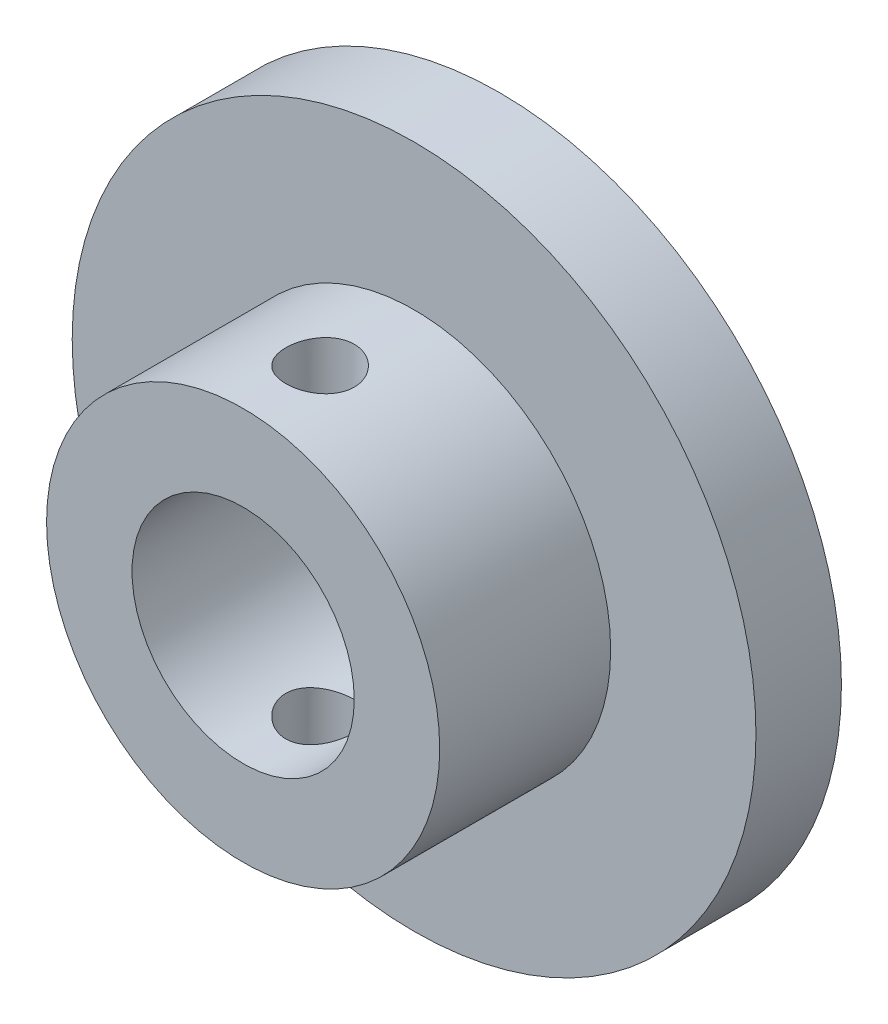
ISO-10303-21;
HEADER;
FILE_DESCRIPTION(('STEP AP214'),'2;1');
FILE_NAME('part.step','',(''),(''),'','','');
FILE_SCHEMA(('AUTOMOTIVE_DESIGN { 1 0 10303 214 1 1 1 1 }'));
ENDSEC;
DATA;
#1=APPLICATION_CONTEXT('core data for automotive mechanical design processes');
#2=APPLICATION_PROTOCOL_DEFINITION('international standard','automotive_design',2000,#1);
#3=PRODUCT_CONTEXT('',#1,'mechanical');
#4=PRODUCT('Part','Part','',(#3));
#5=PRODUCT_RELATED_PRODUCT_CATEGORY('part','',(#4));
#6=PRODUCT_DEFINITION_FORMATION('','',#4);
#7=PRODUCT_DEFINITION_CONTEXT('part definition',#1,'design');
#8=PRODUCT_DEFINITION('design','',#6,#7);
#9=PRODUCT_DEFINITION_SHAPE('','',#8);
#10=(LENGTH_UNIT() NAMED_UNIT(*) SI_UNIT(.MILLI.,.METRE.));
#11=(NAMED_UNIT(*) PLANE_ANGLE_UNIT() SI_UNIT($,.RADIAN.));
#12=(NAMED_UNIT(*) SI_UNIT($,.STERADIAN.) SOLID_ANGLE_UNIT());
#13=UNCERTAINTY_MEASURE_WITH_UNIT(LENGTH_MEASURE(1.E-05),#10,'distance_accuracy_value','');
#14=(GEOMETRIC_REPRESENTATION_CONTEXT(3) GLOBAL_UNCERTAINTY_ASSIGNED_CONTEXT((#13)) GLOBAL_UNIT_ASSIGNED_CONTEXT((#10,
#11,#12)) REPRESENTATION_CONTEXT('',''));
#15=CARTESIAN_POINT('',(0.,0.,0.));
#16=DIRECTION('',(0.,0.,1.));
#17=DIRECTION('',(1.,0.,0.));
#18=AXIS2_PLACEMENT_3D('',#15,#16,#17);
#19=CARTESIAN_POINT('',(0.,0.,2.5));
#20=DIRECTION('',(0.,0.,1.));
#21=DIRECTION('',(1.,0.,0.));
#22=AXIS2_PLACEMENT_3D('',#19,#20,#21);
#23=PLANE('',#22);
#24=CARTESIAN_POINT('',(0.,0.,2.5));
#25=DIRECTION('',(0.,0.,1.));
#26=DIRECTION('',(1.,0.,0.));
#27=AXIS2_PLACEMENT_3D('',#24,#25,#26);
#28=CIRCLE('',#27,20.);
#29=CARTESIAN_POINT('',(20.,0.,2.5));
#30=VERTEX_POINT('',#29);
#31=EDGE_CURVE('E10',#30,#30,#28,.T.);
#32=ORIENTED_EDGE('',*,*,#31,.T.);
#33=EDGE_LOOP('',(#32));
#34=FACE_BOUND('',#33,.T.);
#35=CARTESIAN_POINT('',(0.,0.,2.5));
#36=DIRECTION('',(0.,0.,1.));
#37=DIRECTION('',(1.,0.,0.));
#38=AXIS2_PLACEMENT_3D('',#35,#36,#37);
#39=CIRCLE('',#38,11.5);
#40=CARTESIAN_POINT('',(11.5,0.,2.5));
#41=VERTEX_POINT('',#40);
#42=EDGE_CURVE('E116',#41,#41,#39,.T.);
#43=ORIENTED_EDGE('',*,*,#42,.F.);
#44=EDGE_LOOP('',(#43));
#45=FACE_BOUND('',#44,.T.);
#46=ADVANCED_FACE('F37',(#34,#45),#23,.T.);
#47=CARTESIAN_POINT('',(0.,0.,-2.5));
#48=DIRECTION('',(0.,0.,1.));
#49=DIRECTION('',(1.,0.,0.));
#50=AXIS2_PLACEMENT_3D('',#47,#48,#49);
#51=PLANE('',#50);
#52=CARTESIAN_POINT('',(0.,0.,-2.5));
#53=DIRECTION('',(0.,0.,1.));
#54=DIRECTION('',(1.,0.,0.));
#55=AXIS2_PLACEMENT_3D('',#52,#53,#54);
#56=CIRCLE('',#55,20.);
#57=CARTESIAN_POINT('',(20.,0.,-2.5));
#58=VERTEX_POINT('',#57);
#59=EDGE_CURVE('E51',#58,#58,#56,.T.);
#60=ORIENTED_EDGE('',*,*,#59,.F.);
#61=EDGE_LOOP('',(#60));
#62=FACE_BOUND('',#61,.T.);
#63=CARTESIAN_POINT('',(0.,0.,-2.5));
#64=DIRECTION('',(0.,0.,1.));
#65=DIRECTION('',(1.,0.,0.));
#66=AXIS2_PLACEMENT_3D('',#63,#64,#65);
#67=CIRCLE('',#66,6.5);
#68=CARTESIAN_POINT('',(6.5,0.,-2.5));
#69=VERTEX_POINT('',#68);
#70=EDGE_CURVE('E57',#69,#69,#67,.T.);
#71=ORIENTED_EDGE('',*,*,#70,.T.);
#72=EDGE_LOOP('',(#71));
#73=FACE_BOUND('',#72,.T.);
#74=ADVANCED_FACE('F100',(#62,#73),#51,.F.);
#75=CARTESIAN_POINT('',(0.,0.,2.5));
#76=DIRECTION('',(0.,0.,-1.));
#77=DIRECTION('',(-1.,0.,0.));
#78=AXIS2_PLACEMENT_3D('',#75,#76,#77);
#79=CYLINDRICAL_SURFACE('',#78,20.);
#80=ORIENTED_EDGE('',*,*,#31,.F.);
#81=EDGE_LOOP('',(#80));
#82=FACE_BOUND('',#81,.T.);
#83=ORIENTED_EDGE('',*,*,#59,.T.);
#84=EDGE_LOOP('',(#83));
#85=FACE_BOUND('',#84,.T.);
#86=ADVANCED_FACE('F39',(#82,#85),#79,.T.);
#87=CARTESIAN_POINT('',(0.,0.,2.5));
#88=DIRECTION('',(0.,0.,-1.));
#89=DIRECTION('',(-1.,0.,0.));
#90=AXIS2_PLACEMENT_3D('',#87,#88,#89);
#91=CYLINDRICAL_SURFACE('',#90,6.5);
#92=CARTESIAN_POINT('',(0.,-6.5,10.));
#93=CARTESIAN_POINT('',(0.109586471554081,-6.49999929187436,9.99999903907904));
#94=CARTESIAN_POINT('',(0.219182761349476,-6.49720235792931,9.99096335239673));
#95=CARTESIAN_POINT('',(0.435175528984374,-6.48631855265072,9.95515058806477));
#96=CARTESIAN_POINT('',(0.541571186300282,-6.47823033671536,9.92836900086749));
#97=CARTESIAN_POINT('',(0.748016546984702,-6.45764858487676,9.85804929310721));
#98=CARTESIAN_POINT('',(0.848075627090344,-6.44516174661238,9.81453663922322));
#99=CARTESIAN_POINT('',(1.03947745536718,-6.41707535917941,9.71209679263277));
#100=CARTESIAN_POINT('',(1.13081890919355,-6.40147534884382,9.65316731576617));
#101=CARTESIAN_POINT('',(1.30493699247679,-6.36829752406617,9.51970232456006));
#102=CARTESIAN_POINT('',(1.38741488565838,-6.35067760587489,9.44478758075688));
#103=CARTESIAN_POINT('',(1.53885708269872,-6.31569252815343,9.28228637649204));
#104=CARTESIAN_POINT('',(1.60781896662595,-6.29832741475793,9.19469765172806));
#105=CARTESIAN_POINT('',(1.73187276184925,-6.2653687784566,9.00677139557264));
#106=CARTESIAN_POINT('',(1.78659481361997,-6.24982736044083,8.90617971070223));
#107=CARTESIAN_POINT('',(1.8782224418158,-6.22290748386974,8.69666603626275));
#108=CARTESIAN_POINT('',(1.91513254914664,-6.21152796681115,8.58774617334561));
#109=CARTESIAN_POINT('',(1.96900160513188,-6.19466009001292,8.36803269394755));
#110=CARTESIAN_POINT('',(1.9865133955599,-6.18900890037713,8.25738746639271));
#111=CARTESIAN_POINT('',(2.00281555895419,-6.1837537050085,8.03459625942759));
#112=CARTESIAN_POINT('',(2.00161073572821,-6.18414814760279,7.9224506724825));
#113=CARTESIAN_POINT('',(1.98094698228321,-6.19079569362892,7.7043849294011));
#114=CARTESIAN_POINT('',(1.96218684702854,-6.19682450731138,7.59839057467778));
#115=CARTESIAN_POINT('',(1.90807645250928,-6.21369772255051,7.39113330340309));
#116=CARTESIAN_POINT('',(1.87272447914839,-6.22454262164885,7.28987087689416));
#117=CARTESIAN_POINT('',(1.78593221700801,-6.25000070721951,7.09326995215499));
#118=CARTESIAN_POINT('',(1.73426970827151,-6.2646654217354,6.99803651437156));
#119=CARTESIAN_POINT('',(1.61647725848254,-6.29608673576222,6.81735945562831));
#120=CARTESIAN_POINT('',(1.55034365635742,-6.31284386417593,6.73191832039407));
#121=CARTESIAN_POINT('',(1.40204114131455,-6.34746551983527,6.56929561166795));
#122=CARTESIAN_POINT('',(1.31929416295853,-6.36534631113152,6.49264371743337));
#123=CARTESIAN_POINT('',(1.14189770882472,-6.39954830533241,6.35417779565687));
#124=CARTESIAN_POINT('',(1.04724740490765,-6.4158693995865,6.2923648013595));
#125=CARTESIAN_POINT('',(0.847732923697559,-6.44527556867774,6.1849870228725));
#126=CARTESIAN_POINT('',(0.74279871896691,-6.45833594999018,6.13954513596117));
#127=CARTESIAN_POINT('',(0.526280934909784,-6.47957102319473,6.06711374604147));
#128=CARTESIAN_POINT('',(0.414699321015768,-6.48774715140185,6.04011881798934));
#129=CARTESIAN_POINT('',(0.192552832432245,-6.49806290071844,6.00624195342491));
#130=CARTESIAN_POINT('',(0.0821071867281258,-6.50041772114305,5.9986426474343));
#131=CARTESIAN_POINT('',(-0.13849117800773,-6.49946000316609,6.00175476648801));
#132=CARTESIAN_POINT('',(-0.248643936188296,-6.49614826472318,6.01246360693707));
#133=CARTESIAN_POINT('',(-0.462785801451478,-6.48437074848215,6.05131048211023));
#134=CARTESIAN_POINT('',(-0.566859358780054,-6.47603039774079,6.07902464716616));
#135=CARTESIAN_POINT('',(-0.76885281136936,-6.45516726536364,6.1505810764271));
#136=CARTESIAN_POINT('',(-0.866771952253667,-6.44264397218779,6.19442531327608));
#137=CARTESIAN_POINT('',(-1.05627961444668,-6.41433382910965,6.29817119480995));
#138=CARTESIAN_POINT('',(-1.14766081519562,-6.39847611273321,6.35843167676517));
#139=CARTESIAN_POINT('',(-1.31925606832412,-6.36531333623025,6.49286683008083));
#140=CARTESIAN_POINT('',(-1.39946717074091,-6.34800789569184,6.56704516497603));
#141=CARTESIAN_POINT('',(-1.54963528009096,-6.31306645909658,6.73058329944897));
#142=CARTESIAN_POINT('',(-1.61908131008095,-6.29544322340724,6.82041607594928));
#143=CARTESIAN_POINT('',(-1.74195487773042,-6.26255963317191,7.01084333460187));
#144=CARTESIAN_POINT('',(-1.79538273895787,-6.24729923089955,7.11143759931574));
#145=CARTESIAN_POINT('',(-1.88435707765313,-6.22104126828922,7.32027825692904));
#146=CARTESIAN_POINT('',(-1.91997867102389,-6.21002584634022,7.42849026977304));
#147=CARTESIAN_POINT('',(-1.97237526121824,-6.19358575896332,7.64978261572606));
#148=CARTESIAN_POINT('',(-1.98915714872108,-6.18815904950702,7.76286115316602));
#149=CARTESIAN_POINT('',(-2.00291323790433,-6.18371932373484,7.98534807210792));
#150=CARTESIAN_POINT('',(-2.00072360720728,-6.18443554393433,8.09470000455106));
#151=CARTESIAN_POINT('',(-1.97860856561739,-6.19154584982148,8.31139783884726));
#152=CARTESIAN_POINT('',(-1.95868393542585,-6.19793968557834,8.41874382879029));
#153=CARTESIAN_POINT('',(-1.90221657867545,-6.21549850608435,8.6269374285375));
#154=CARTESIAN_POINT('',(-1.8659061649831,-6.22659666514378,8.72785410568484));
#155=CARTESIAN_POINT('',(-1.77788001247773,-6.25229841004041,8.92224355662551));
#156=CARTESIAN_POINT('',(-1.72616121006625,-6.26690269287625,9.01571484538876));
#157=CARTESIAN_POINT('',(-1.60648172875982,-6.29866516433667,9.19641250748051));
#158=CARTESIAN_POINT('',(-1.5379775201733,-6.31589943241281,9.28326549413256));
#159=CARTESIAN_POINT('',(-1.38763671757875,-6.35062263668655,9.44451406697947));
#160=CARTESIAN_POINT('',(-1.30579660000223,-6.36811163907406,9.51890635028652));
#161=CARTESIAN_POINT('',(-1.12802317077525,-6.40203042414332,9.65544917959683));
#162=CARTESIAN_POINT('',(-1.03172886568531,-6.41840990638034,9.71714357533484));
#163=CARTESIAN_POINT('',(-0.829631192009798,-6.44764383058531,9.82338445665249));
#164=CARTESIAN_POINT('',(-0.723831864032401,-6.46049976109691,9.86793818662102));
#165=CARTESIAN_POINT('',(-0.515929652571417,-6.48025348346413,9.93510071206019));
#166=CARTESIAN_POINT('',(-0.414403258515525,-6.48759534805451,9.95936947108914));
#167=CARTESIAN_POINT('',(-0.208587191828517,-6.4974684909107,9.99181805932323));
#168=CARTESIAN_POINT('',(-0.104298042658334,-6.50000067395288,10.0000009145488));
#169=CARTESIAN_POINT('',(0.,-6.5,10.));
#170=B_SPLINE_CURVE_WITH_KNOTS('',3,(#92,#93,#94,#95,#96,#97,#98,#99,#100,#101,#102,#103,#104,
#105,#106,#107,#108,#109,#110,#111,#112,#113,#114,#115,#116,#117,#118,#119,#120,#121,#122,#123,
#124,#125,#126,#127,#128,#129,#130,#131,#132,#133,#134,#135,#136,#137,#138,#139,#140,#141,#142,
#143,#144,#145,#146,#147,#148,#149,#150,#151,#152,#153,#154,#155,#156,#157,#158,#159,#160,#161,
#162,#163,#164,#165,#166,#167,#168,#169),.UNSPECIFIED.,.T.,.F.,(4,2,2,2,2,2,2,2,2,2,2,2,2,2,2,2,
2,2,2,2,2,2,2,2,2,2,2,2,2,2,2,2,2,2,2,2,2,2,4),(0.,0.328376148353204,0.656835774920463,
0.984797413319643,1.31280767013794,1.64969601962051,1.98664463123191,2.33162619975385,
2.67651996741947,3.0113091274622,3.34601236190892,3.66793485951994,3.98989062214147,
4.3164372458817,4.64306657905952,4.98408507994296,5.32512731933627,5.66867887562647,
6.01212935372403,6.34267966649236,6.67318331870836,6.99576592200041,7.31838798898982,
7.6487232534981,7.97914559299321,8.32223487802099,8.6653172321574,9.00693981167224,
9.34843740094786,9.67496275718918,10.0014737403731,10.3234943027839,10.6455789342452,
10.9799294848454,11.3143685200785,11.6592775258489,12.0040405975475,12.3166287634493,
12.6291581207982),.UNSPECIFIED.);
#171=CARTESIAN_POINT('',(0.,-6.5,10.));
#172=VERTEX_POINT('',#171);
#173=EDGE_CURVE('E88',#172,#172,#170,.T.);
#174=ORIENTED_EDGE('',*,*,#173,.F.);
#175=EDGE_LOOP('',(#174));
#176=FACE_BOUND('',#175,.T.);
#177=CARTESIAN_POINT('',(0.,6.5,10.));
#178=CARTESIAN_POINT('',(-0.109586471554079,6.49999929187436,9.99999903907904));
#179=CARTESIAN_POINT('',(-0.219182761349474,6.49720235792931,9.99096335239673));
#180=CARTESIAN_POINT('',(-0.435175528984372,6.48631855265072,9.95515058806477));
#181=CARTESIAN_POINT('',(-0.54157118630028,6.47823033671536,9.92836900086749));
#182=CARTESIAN_POINT('',(-0.7480165469847,6.45764858487676,9.85804929310721));
#183=CARTESIAN_POINT('',(-0.848075627090341,6.44516174661238,9.81453663922322));
#184=CARTESIAN_POINT('',(-1.03947745536717,6.41707535917941,9.71209679263276));
#185=CARTESIAN_POINT('',(-1.13081890919355,6.40147534884382,9.65316731576617));
#186=CARTESIAN_POINT('',(-1.30493699247679,6.36829752406617,9.51970232456006));
#187=CARTESIAN_POINT('',(-1.38741488565838,6.35067760587489,9.44478758075688));
#188=CARTESIAN_POINT('',(-1.53885708269872,6.31569252815343,9.28228637649205));
#189=CARTESIAN_POINT('',(-1.60781896662595,6.29832741475793,9.19469765172807));
#190=CARTESIAN_POINT('',(-1.73187276184925,6.2653687784566,9.00677139557264));
#191=CARTESIAN_POINT('',(-1.78659481361997,6.24982736044084,8.90617971070223));
#192=CARTESIAN_POINT('',(-1.87822244181579,6.22290748386974,8.69666603626275));
#193=CARTESIAN_POINT('',(-1.91513254914664,6.21152796681115,8.58774617334561));
#194=CARTESIAN_POINT('',(-1.96900160513188,6.19466009001292,8.36803269394755));
#195=CARTESIAN_POINT('',(-1.9865133955599,6.18900890037713,8.25738746639271));
#196=CARTESIAN_POINT('',(-2.00281555895419,6.1837537050085,8.03459625942759));
#197=CARTESIAN_POINT('',(-2.00161073572821,6.18414814760279,7.92245067248251));
#198=CARTESIAN_POINT('',(-1.98094698228321,6.19079569362892,7.7043849294011));
#199=CARTESIAN_POINT('',(-1.96218684702854,6.19682450731138,7.59839057467778));
#200=CARTESIAN_POINT('',(-1.90807645250928,6.21369772255051,7.3911333034031));
#201=CARTESIAN_POINT('',(-1.87272447914839,6.22454262164885,7.28987087689416));
#202=CARTESIAN_POINT('',(-1.785932217008,6.25000070721951,7.09326995215499));
#203=CARTESIAN_POINT('',(-1.73426970827151,6.2646654217354,6.99803651437156));
#204=CARTESIAN_POINT('',(-1.61647725848254,6.29608673576222,6.81735945562831));
#205=CARTESIAN_POINT('',(-1.55034365635742,6.31284386417593,6.73191832039407));
#206=CARTESIAN_POINT('',(-1.40204114131455,6.34746551983527,6.56929561166795));
#207=CARTESIAN_POINT('',(-1.31929416295853,6.36534631113152,6.49264371743337));
#208=CARTESIAN_POINT('',(-1.14189770882472,6.39954830533241,6.35417779565687));
#209=CARTESIAN_POINT('',(-1.04724740490765,6.4158693995865,6.29236480135951));
#210=CARTESIAN_POINT('',(-0.847732923697557,6.44527556867774,6.1849870228725));
#211=CARTESIAN_POINT('',(-0.742798718966908,6.45833594999018,6.13954513596117));
#212=CARTESIAN_POINT('',(-0.526280934909783,6.47957102319473,6.06711374604147));
#213=CARTESIAN_POINT('',(-0.414699321015767,6.48774715140185,6.04011881798934));
#214=CARTESIAN_POINT('',(-0.192552832432244,6.49806290071844,6.00624195342491));
#215=CARTESIAN_POINT('',(-0.0821071867281242,6.50041772114305,5.9986426474343));
#216=CARTESIAN_POINT('',(0.138491178007732,6.49946000316609,6.00175476648801));
#217=CARTESIAN_POINT('',(0.248643936188298,6.49614826472318,6.01246360693707));
#218=CARTESIAN_POINT('',(0.46278580145148,6.48437074848215,6.05131048211023));
#219=CARTESIAN_POINT('',(0.566859358780056,6.47603039774079,6.07902464716616));
#220=CARTESIAN_POINT('',(0.768852811369362,6.45516726536364,6.1505810764271));
#221=CARTESIAN_POINT('',(0.866771952253669,6.44264397218779,6.19442531327608));
#222=CARTESIAN_POINT('',(1.05627961444668,6.41433382910965,6.29817119480995));
#223=CARTESIAN_POINT('',(1.14766081519562,6.39847611273321,6.35843167676517));
#224=CARTESIAN_POINT('',(1.31925606832413,6.36531333623025,6.49286683008083));
#225=CARTESIAN_POINT('',(1.39946717074091,6.34800789569184,6.56704516497603));
#226=CARTESIAN_POINT('',(1.54963528009096,6.31306645909658,6.73058329944897));
#227=CARTESIAN_POINT('',(1.61908131008095,6.29544322340724,6.82041607594928));
#228=CARTESIAN_POINT('',(1.74195487773042,6.26255963317191,7.01084333460187));
#229=CARTESIAN_POINT('',(1.79538273895787,6.24729923089955,7.11143759931574));
#230=CARTESIAN_POINT('',(1.88435707765313,6.22104126828921,7.32027825692904));
#231=CARTESIAN_POINT('',(1.9199786710239,6.21002584634022,7.42849026977304));
#232=CARTESIAN_POINT('',(1.97237526121825,6.19358575896332,7.64978261572606));
#233=CARTESIAN_POINT('',(1.98915714872108,6.18815904950702,7.76286115316602));
#234=CARTESIAN_POINT('',(2.00291323790433,6.18371932373484,7.98534807210793));
#235=CARTESIAN_POINT('',(2.00072360720728,6.18443554393433,8.09470000455106));
#236=CARTESIAN_POINT('',(1.97860856561739,6.19154584982148,8.31139783884726));
#237=CARTESIAN_POINT('',(1.95868393542585,6.19793968557834,8.41874382879029));
#238=CARTESIAN_POINT('',(1.90221657867545,6.21549850608435,8.6269374285375));
#239=CARTESIAN_POINT('',(1.86590616498311,6.22659666514378,8.72785410568484));
#240=CARTESIAN_POINT('',(1.77788001247773,6.25229841004041,8.92224355662551));
#241=CARTESIAN_POINT('',(1.72616121006625,6.26690269287625,9.01571484538877));
#242=CARTESIAN_POINT('',(1.60648172875982,6.29866516433667,9.19641250748051));
#243=CARTESIAN_POINT('',(1.5379775201733,6.31589943241281,9.28326549413257));
#244=CARTESIAN_POINT('',(1.38763671757875,6.35062263668655,9.44451406697947));
#245=CARTESIAN_POINT('',(1.30579660000223,6.36811163907406,9.51890635028652));
#246=CARTESIAN_POINT('',(1.12802317077526,6.40203042414331,9.65544917959683));
#247=CARTESIAN_POINT('',(1.03172886568531,6.41840990638034,9.71714357533484));
#248=CARTESIAN_POINT('',(0.8296311920098,6.44764383058531,9.82338445665249));
#249=CARTESIAN_POINT('',(0.723831864032403,6.46049976109691,9.86793818662102));
#250=CARTESIAN_POINT('',(0.515929652571419,6.48025348346413,9.93510071206019));
#251=CARTESIAN_POINT('',(0.414403258515527,6.48759534805451,9.95936947108914));
#252=CARTESIAN_POINT('',(0.208587191828518,6.4974684909107,9.99181805932323));
#253=CARTESIAN_POINT('',(0.104298042658335,6.50000067395288,10.0000009145488));
#254=CARTESIAN_POINT('',(0.,6.5,10.));
#255=B_SPLINE_CURVE_WITH_KNOTS('',3,(#177,#178,#179,#180,#181,#182,#183,#184,#185,#186,#187,
#188,#189,#190,#191,#192,#193,#194,#195,#196,#197,#198,#199,#200,#201,#202,#203,#204,#205,#206,
#207,#208,#209,#210,#211,#212,#213,#214,#215,#216,#217,#218,#219,#220,#221,#222,#223,#224,#225,
#226,#227,#228,#229,#230,#231,#232,#233,#234,#235,#236,#237,#238,#239,#240,#241,#242,#243,#244,
#245,#246,#247,#248,#249,#250,#251,#252,#253,#254),.UNSPECIFIED.,.T.,.F.,(4,2,2,2,2,2,2,2,2,2,2,
2,2,2,2,2,2,2,2,2,2,2,2,2,2,2,2,2,2,2,2,2,2,2,2,2,2,2,4),(0.,0.328376148353204,
0.656835774920463,0.984797413319643,1.31280767013794,1.64969601962051,1.98664463123191,
2.33162619975384,2.67651996741947,3.0113091274622,3.34601236190892,3.66793485951994,
3.98989062214147,4.3164372458817,4.64306657905952,4.98408507994296,5.32512731933627,
5.66867887562647,6.01212935372403,6.34267966649236,6.67318331870836,6.99576592200041,
7.31838798898982,7.6487232534981,7.97914559299321,8.322234878021,8.66531723215741,
9.00693981167225,9.34843740094787,9.67496275718919,10.0014737403731,10.3234943027839,
10.6455789342452,10.9799294848454,11.3143685200785,11.6592775258489,12.0040405975475,
12.3166287634493,12.6291581207982),.UNSPECIFIED.);
#256=CARTESIAN_POINT('',(0.,6.5,10.));
#257=VERTEX_POINT('',#256);
#258=EDGE_CURVE('E82',#257,#257,#255,.T.);
#259=ORIENTED_EDGE('',*,*,#258,.F.);
#260=EDGE_LOOP('',(#259));
#261=FACE_BOUND('',#260,.T.);
#262=ORIENTED_EDGE('',*,*,#70,.F.);
#263=EDGE_LOOP('',(#262));
#264=FACE_BOUND('',#263,.T.);
#265=CARTESIAN_POINT('',(0.,0.,12.5));
#266=DIRECTION('',(0.,0.,1.));
#267=DIRECTION('',(1.,0.,0.));
#268=AXIS2_PLACEMENT_3D('',#265,#266,#267);
#269=CIRCLE('',#268,6.5);
#270=CARTESIAN_POINT('',(6.5,0.,12.5));
#271=VERTEX_POINT('',#270);
#272=EDGE_CURVE('E122',#271,#271,#269,.T.);
#273=ORIENTED_EDGE('',*,*,#272,.T.);
#274=EDGE_LOOP('',(#273));
#275=FACE_BOUND('',#274,.T.);
#276=ADVANCED_FACE('F93',(#176,#261,#264,#275),#91,.F.);
#277=CARTESIAN_POINT('',(0.,0.,12.5));
#278=DIRECTION('',(0.,0.,1.));
#279=DIRECTION('',(1.,0.,0.));
#280=AXIS2_PLACEMENT_3D('',#277,#278,#279);
#281=PLANE('',#280);
#282=CARTESIAN_POINT('',(0.,0.,12.5));
#283=DIRECTION('',(0.,0.,1.));
#284=DIRECTION('',(1.,0.,0.));
#285=AXIS2_PLACEMENT_3D('',#282,#283,#284);
#286=CIRCLE('',#285,11.5);
#287=CARTESIAN_POINT('',(11.5,0.,12.5));
#288=VERTEX_POINT('',#287);
#289=EDGE_CURVE('E113',#288,#288,#286,.T.);
#290=ORIENTED_EDGE('',*,*,#289,.T.);
#291=EDGE_LOOP('',(#290));
#292=FACE_BOUND('',#291,.T.);
#293=ORIENTED_EDGE('',*,*,#272,.F.);
#294=EDGE_LOOP('',(#293));
#295=FACE_BOUND('',#294,.T.);
#296=ADVANCED_FACE('F76',(#292,#295),#281,.T.);
#297=CARTESIAN_POINT('',(0.,0.,12.5));
#298=DIRECTION('',(0.,0.,-1.));
#299=DIRECTION('',(-1.,0.,0.));
#300=AXIS2_PLACEMENT_3D('',#297,#298,#299);
#301=CYLINDRICAL_SURFACE('',#300,11.5);
#302=CARTESIAN_POINT('',(0.,-11.5,10.));
#303=CARTESIAN_POINT('',(0.1114399872612,-11.4999980464568,9.999995597781));
#304=CARTESIAN_POINT('',(0.222938986867313,-11.4983633236693,9.99065437802476));
#305=CARTESIAN_POINT('',(0.442804831006433,-11.4919995535027,9.95355469346906));
#306=CARTESIAN_POINT('',(0.551168784068873,-11.4872677390533,9.92577975891287));
#307=CARTESIAN_POINT('',(0.761552143470367,-11.4752400457699,9.85268074510846));
#308=CARTESIAN_POINT('',(0.863576837092959,-11.4679463384169,9.80737152476115));
#309=CARTESIAN_POINT('',(1.05856414232358,-11.4515949757715,9.70053013502208));
#310=CARTESIAN_POINT('',(1.15152768672068,-11.4425375023363,9.63899963793118));
#311=CARTESIAN_POINT('',(1.32672978916094,-11.4235561904614,9.50078394252296));
#312=CARTESIAN_POINT('',(1.40886074189962,-11.4136250881568,9.42396332695285));
#313=CARTESIAN_POINT('',(1.55913628730681,-11.3940708420576,9.25763948382236));
#314=CARTESIAN_POINT('',(1.62727995780311,-11.3844477186031,9.16813542070789));
#315=CARTESIAN_POINT('',(1.74808334588333,-11.3665285883869,8.97823899095896));
#316=CARTESIAN_POINT('',(1.80063562522425,-11.3582419618416,8.87777731444854));
#317=CARTESIAN_POINT('',(1.88807717664308,-11.344035410303,8.66928372691354));
#318=CARTESIAN_POINT('',(1.92296775122102,-11.338115310792,8.56125237479992));
#319=CARTESIAN_POINT('',(1.97375430124635,-11.3293847096578,8.34183041707076));
#320=CARTESIAN_POINT('',(1.98983670158454,-11.3265437093043,8.23048419745888));
#321=CARTESIAN_POINT('',(2.00312861182873,-11.3242008268519,8.00664025545629));
#322=CARTESIAN_POINT('',(2.00033957611786,-11.3246986874338,7.89414262246986));
#323=CARTESIAN_POINT('',(1.97611940396107,-11.3289494543522,7.67252663907155));
#324=CARTESIAN_POINT('',(1.95489854149192,-11.332665643951,7.56338450077672));
#325=CARTESIAN_POINT('',(1.89474747798642,-11.3428768092161,7.35023364884982));
#326=CARTESIAN_POINT('',(1.85581662056814,-11.3493718878753,7.24622512564227));
#327=CARTESIAN_POINT('',(1.76114002578922,-11.364448234638,7.04566921030961));
#328=CARTESIAN_POINT('',(1.7053077821909,-11.3730401902522,6.9491634917419));
#329=CARTESIAN_POINT('',(1.57847462401363,-11.3913348970239,6.76681087155867));
#330=CARTESIAN_POINT('',(1.50747237912897,-11.4010377455644,6.68096490577542));
#331=CARTESIAN_POINT('',(1.35117304022646,-11.4206218587533,6.52115221915782));
#332=CARTESIAN_POINT('',(1.26569571727498,-11.4305037623993,6.44736172995078));
#333=CARTESIAN_POINT('',(1.08347997757355,-11.4492115670972,6.31514331951479));
#334=CARTESIAN_POINT('',(0.986741475801936,-11.4580374601752,6.25671551428463));
#335=CARTESIAN_POINT('',(0.784577663905633,-11.4736530246222,6.15686168379411));
#336=CARTESIAN_POINT('',(0.679144045989308,-11.4804407191691,6.11545215007862));
#337=CARTESIAN_POINT('',(0.462673794869467,-11.4911994491431,6.05097875327131));
#338=CARTESIAN_POINT('',(0.351637673576867,-11.4951707414126,6.02791321727158));
#339=CARTESIAN_POINT('',(0.128632340091335,-11.4998144246932,6.00102360339251));
#340=CARTESIAN_POINT('',(0.0166931139492514,-11.5005282640865,5.99695775415839));
#341=CARTESIAN_POINT('',(-0.206266547102301,-11.4986904598945,6.00753703203957));
#342=CARTESIAN_POINT('',(-0.317287020424384,-11.4961389535331,6.02218137287219));
#343=CARTESIAN_POINT('',(-0.534504194826881,-11.4880828547161,6.06956425367503));
#344=CARTESIAN_POINT('',(-0.64072799264671,-11.4825979491405,6.10218221132815));
#345=CARTESIAN_POINT('',(-0.846199490198303,-11.469287521649,6.18445722699756));
#346=CARTESIAN_POINT('',(-0.945446769360286,-11.461461858773,6.23411531119479));
#347=CARTESIAN_POINT('',(-1.13519201472245,-11.4442348843544,6.34960844586078));
#348=CARTESIAN_POINT('',(-1.22559739955802,-11.4348192425939,6.41559341997047));
#349=CARTESIAN_POINT('',(-1.39413850431969,-11.4154976873865,6.56166216572134));
#350=CARTESIAN_POINT('',(-1.47227324761394,-11.4055917349978,6.64174705851336));
#351=CARTESIAN_POINT('',(-1.61495889061391,-11.3862708192041,6.81483019172949));
#352=CARTESIAN_POINT('',(-1.67934587153711,-11.376862689564,6.90796444823635));
#353=CARTESIAN_POINT('',(-1.79156091519117,-11.3597334956488,7.10386904013996));
#354=CARTESIAN_POINT('',(-1.83938953549079,-11.3520123745704,7.20663905092436));
#355=CARTESIAN_POINT('',(-1.91688925721392,-11.3391834856491,7.41845371905516));
#356=CARTESIAN_POINT('',(-1.9466397793412,-11.3340643034392,7.52746859465862));
#357=CARTESIAN_POINT('',(-1.98738717284104,-11.3269910994359,7.74904544140679));
#358=CARTESIAN_POINT('',(-1.99838583477912,-11.3250367754396,7.86160707283568));
#359=CARTESIAN_POINT('',(-2.00126398709899,-11.3245283716057,8.08544376296605));
#360=CARTESIAN_POINT('',(-1.99340166065945,-11.3259283749265,8.19671548108664));
#361=CARTESIAN_POINT('',(-1.95934163174623,-11.3318698519737,8.41632649492187));
#362=CARTESIAN_POINT('',(-1.93314400443713,-11.3364113128219,8.52466580265588));
#363=CARTESIAN_POINT('',(-1.86325935923312,-11.3481059077653,8.73522368423037));
#364=CARTESIAN_POINT('',(-1.81959649949322,-11.3552554331514,8.83745048938004));
#365=CARTESIAN_POINT('',(-1.71604786277069,-11.3713637381662,9.03316944631653));
#366=CARTESIAN_POINT('',(-1.65616116491746,-11.3803226204872,9.12666110188805));
#367=CARTESIAN_POINT('',(-1.52095132463558,-11.3991847635828,9.30355663856667));
#368=CARTESIAN_POINT('',(-1.44543890180401,-11.409098721948,9.38681472503435));
#369=CARTESIAN_POINT('',(-1.28151898998877,-11.4286704477839,9.53956540348812));
#370=CARTESIAN_POINT('',(-1.19310853571196,-11.438328155737,9.60905482133252));
#371=CARTESIAN_POINT('',(-1.00510213248861,-11.4563845579892,9.73278159348388));
#372=CARTESIAN_POINT('',(-0.905426380799608,-11.4647731402985,9.78689918479483));
#373=CARTESIAN_POINT('',(-0.698290141761012,-11.4792477236034,9.87753710922957));
#374=CARTESIAN_POINT('',(-0.590837379696677,-11.4853359732199,9.91407463682224));
#375=CARTESIAN_POINT('',(-0.402499760766275,-11.4932243439483,9.96075488736984));
#376=CARTESIAN_POINT('',(-0.32274213993847,-11.4957513793936,9.97544771368241));
#377=CARTESIAN_POINT('',(-0.162000059486064,-11.499139901069,9.99507177375368));
#378=CARTESIAN_POINT('',(-0.0810156241309405,-11.5000014202041,10.000003200364));
#379=CARTESIAN_POINT('',(0.,-11.5,10.));
#380=B_SPLINE_CURVE_WITH_KNOTS('',3,(#302,#303,#304,#305,#306,#307,#308,#309,#310,#311,#312,
#313,#314,#315,#316,#317,#318,#319,#320,#321,#322,#323,#324,#325,#326,#327,#328,#329,#330,#331,
#332,#333,#334,#335,#336,#337,#338,#339,#340,#341,#342,#343,#344,#345,#346,#347,#348,#349,#350,
#351,#352,#353,#354,#355,#356,#357,#358,#359,#360,#361,#362,#363,#364,#365,#366,#367,#368,#369,
#370,#371,#372,#373,#374,#375,#376,#377,#378,#379),.UNSPECIFIED.,.T.,.F.,(4,2,2,2,2,2,2,2,2,2,2,
2,2,2,2,2,2,2,2,2,2,2,2,2,2,2,2,2,2,2,2,2,2,2,2,2,2,2,4),(0.,0.334023779028205,
0.668346396880414,1.002386321331,1.33639182204538,1.67349881344175,2.01062802294381,
2.35002908862658,2.68940512080716,3.02538798701145,3.3613449599958,3.69351887233486,
4.02570509697098,4.35962115059283,4.69356649840416,5.0320251979663,5.37048645305,
5.70927492479025,6.04803249667268,6.38246741616022,6.71688828171608,7.049092411327,
7.38131655026052,7.71671261281744,8.05213535634693,8.39135808486806,8.73056938964974,
9.06827948936411,9.40595734022818,9.73903924196995,10.0721197782684,10.4047411773155,
10.7373814600237,11.0743155805132,11.4113272855188,11.7508968407607,12.0901335958935,
12.3329699443933,12.5758014952362),.UNSPECIFIED.);
#381=CARTESIAN_POINT('',(0.,-11.5,10.));
#382=VERTEX_POINT('',#381);
#383=EDGE_CURVE('E41',#382,#382,#380,.T.);
#384=ORIENTED_EDGE('',*,*,#383,.T.);
#385=EDGE_LOOP('',(#384));
#386=FACE_BOUND('',#385,.T.);
#387=CARTESIAN_POINT('',(0.,11.5,10.));
#388=CARTESIAN_POINT('',(-0.111439987261198,11.4999980464568,9.999995597781));
#389=CARTESIAN_POINT('',(-0.222938986867311,11.4983633236693,9.99065437802476));
#390=CARTESIAN_POINT('',(-0.442804831006431,11.4919995535027,9.95355469346906));
#391=CARTESIAN_POINT('',(-0.551168784068871,11.4872677390533,9.92577975891287));
#392=CARTESIAN_POINT('',(-0.761552143470365,11.4752400457699,9.85268074510846));
#393=CARTESIAN_POINT('',(-0.863576837092957,11.4679463384169,9.80737152476115));
#394=CARTESIAN_POINT('',(-1.05856414232358,11.4515949757715,9.70053013502208));
#395=CARTESIAN_POINT('',(-1.15152768672068,11.4425375023363,9.63899963793118));
#396=CARTESIAN_POINT('',(-1.32672978916093,11.4235561904614,9.50078394252296));
#397=CARTESIAN_POINT('',(-1.40886074189962,11.4136250881568,9.42396332695286));
#398=CARTESIAN_POINT('',(-1.55913628730681,11.3940708420576,9.25763948382236));
#399=CARTESIAN_POINT('',(-1.6272799578031,11.3844477186031,9.16813542070789));
#400=CARTESIAN_POINT('',(-1.74808334588333,11.366528588387,8.97823899095896));
#401=CARTESIAN_POINT('',(-1.80063562522425,11.3582419618416,8.87777731444854));
#402=CARTESIAN_POINT('',(-1.88807717664308,11.344035410303,8.66928372691354));
#403=CARTESIAN_POINT('',(-1.92296775122101,11.338115310792,8.56125237479992));
#404=CARTESIAN_POINT('',(-1.97375430124635,11.3293847096578,8.34183041707076));
#405=CARTESIAN_POINT('',(-1.98983670158453,11.3265437093043,8.23048419745888));
#406=CARTESIAN_POINT('',(-2.00312861182873,11.3242008268519,8.00664025545629));
#407=CARTESIAN_POINT('',(-2.00033957611786,11.3246986874338,7.89414262246985));
#408=CARTESIAN_POINT('',(-1.97611940396107,11.3289494543522,7.67252663907155));
#409=CARTESIAN_POINT('',(-1.95489854149192,11.332665643951,7.56338450077671));
#410=CARTESIAN_POINT('',(-1.89474747798642,11.3428768092161,7.35023364884981));
#411=CARTESIAN_POINT('',(-1.85581662056814,11.3493718878753,7.24622512564227));
#412=CARTESIAN_POINT('',(-1.76114002578922,11.364448234638,7.04566921030961));
#413=CARTESIAN_POINT('',(-1.70530778219089,11.3730401902522,6.9491634917419));
#414=CARTESIAN_POINT('',(-1.57847462401363,11.3913348970239,6.76681087155867));
#415=CARTESIAN_POINT('',(-1.50747237912897,11.4010377455644,6.68096490577542));
#416=CARTESIAN_POINT('',(-1.35117304022646,11.4206218587533,6.52115221915782));
#417=CARTESIAN_POINT('',(-1.26569571727498,11.4305037623993,6.44736172995078));
#418=CARTESIAN_POINT('',(-1.08347997757354,11.4492115670972,6.31514331951479));
#419=CARTESIAN_POINT('',(-0.986741475801933,11.4580374601752,6.25671551428463));
#420=CARTESIAN_POINT('',(-0.78457766390563,11.4736530246222,6.15686168379411));
#421=CARTESIAN_POINT('',(-0.679144045989306,11.4804407191691,6.11545215007862));
#422=CARTESIAN_POINT('',(-0.462673794869464,11.4911994491431,6.05097875327131));
#423=CARTESIAN_POINT('',(-0.351637673576865,11.4951707414126,6.02791321727158));
#424=CARTESIAN_POINT('',(-0.128632340091332,11.4998144246932,6.00102360339251));
#425=CARTESIAN_POINT('',(-0.0166931139492493,11.5005282640865,5.99695775415839));
#426=CARTESIAN_POINT('',(0.206266547102303,11.4986904598945,6.00753703203957));
#427=CARTESIAN_POINT('',(0.317287020424386,11.4961389535331,6.02218137287219));
#428=CARTESIAN_POINT('',(0.534504194826883,11.4880828547161,6.06956425367503));
#429=CARTESIAN_POINT('',(0.640727992646712,11.4825979491405,6.10218221132815));
#430=CARTESIAN_POINT('',(0.846199490198306,11.469287521649,6.18445722699756));
#431=CARTESIAN_POINT('',(0.945446769360289,11.461461858773,6.23411531119479));
#432=CARTESIAN_POINT('',(1.13519201472245,11.4442348843544,6.34960844586078));
#433=CARTESIAN_POINT('',(1.22559739955802,11.4348192425939,6.41559341997047));
#434=CARTESIAN_POINT('',(1.39413850431969,11.4154976873865,6.56166216572134));
#435=CARTESIAN_POINT('',(1.47227324761394,11.4055917349978,6.64174705851336));
#436=CARTESIAN_POINT('',(1.61495889061391,11.3862708192041,6.81483019172949));
#437=CARTESIAN_POINT('',(1.67934587153712,11.376862689564,6.90796444823635));
#438=CARTESIAN_POINT('',(1.79156091519118,11.3597334956488,7.10386904013996));
#439=CARTESIAN_POINT('',(1.83938953549079,11.3520123745704,7.20663905092437));
#440=CARTESIAN_POINT('',(1.91688925721392,11.3391834856491,7.41845371905516));
#441=CARTESIAN_POINT('',(1.9466397793412,11.3340643034392,7.52746859465862));
#442=CARTESIAN_POINT('',(1.98738717284104,11.3269910994359,7.74904544140679));
#443=CARTESIAN_POINT('',(1.99838583477912,11.3250367754396,7.86160707283568));
#444=CARTESIAN_POINT('',(2.001263987099,11.3245283716057,8.08544376296605));
#445=CARTESIAN_POINT('',(1.99340166065945,11.3259283749265,8.19671548108664));
#446=CARTESIAN_POINT('',(1.95934163174623,11.3318698519737,8.41632649492187));
#447=CARTESIAN_POINT('',(1.93314400443713,11.3364113128219,8.52466580265588));
#448=CARTESIAN_POINT('',(1.86325935923312,11.3481059077653,8.73522368423037));
#449=CARTESIAN_POINT('',(1.81959649949323,11.3552554331514,8.83745048938004));
#450=CARTESIAN_POINT('',(1.71604786277069,11.3713637381662,9.03316944631653));
#451=CARTESIAN_POINT('',(1.65616116491746,11.3803226204873,9.12666110188805));
#452=CARTESIAN_POINT('',(1.52095132463558,11.3991847635828,9.30355663856667));
#453=CARTESIAN_POINT('',(1.44543890180401,11.409098721948,9.38681472503435));
#454=CARTESIAN_POINT('',(1.28151898998877,11.4286704477839,9.53956540348812));
#455=CARTESIAN_POINT('',(1.19310853571197,11.438328155737,9.60905482133252));
#456=CARTESIAN_POINT('',(1.00510213248861,11.4563845579892,9.73278159348389));
#457=CARTESIAN_POINT('',(0.905426380799609,11.4647731402985,9.78689918479483));
#458=CARTESIAN_POINT('',(0.698290141761013,11.4792477236034,9.87753710922957));
#459=CARTESIAN_POINT('',(0.590837379696679,11.4853359732199,9.91407463682224));
#460=CARTESIAN_POINT('',(0.402499760766278,11.4932243439483,9.96075488736984));
#461=CARTESIAN_POINT('',(0.322742139938473,11.4957513793936,9.97544771368241));
#462=CARTESIAN_POINT('',(0.162000059486066,11.499139901069,9.99507177375368));
#463=CARTESIAN_POINT('',(0.0810156241309427,11.5000014202041,10.000003200364));
#464=CARTESIAN_POINT('',(0.,11.5,10.));
#465=B_SPLINE_CURVE_WITH_KNOTS('',3,(#387,#388,#389,#390,#391,#392,#393,#394,#395,#396,#397,
#398,#399,#400,#401,#402,#403,#404,#405,#406,#407,#408,#409,#410,#411,#412,#413,#414,#415,#416,
#417,#418,#419,#420,#421,#422,#423,#424,#425,#426,#427,#428,#429,#430,#431,#432,#433,#434,#435,
#436,#437,#438,#439,#440,#441,#442,#443,#444,#445,#446,#447,#448,#449,#450,#451,#452,#453,#454,
#455,#456,#457,#458,#459,#460,#461,#462,#463,#464),.UNSPECIFIED.,.T.,.F.,(4,2,2,2,2,2,2,2,2,2,2,
2,2,2,2,2,2,2,2,2,2,2,2,2,2,2,2,2,2,2,2,2,2,2,2,2,2,2,4),(0.,0.334023779028205,
0.668346396880414,1.002386321331,1.33639182204538,1.67349881344175,2.01062802294381,
2.35002908862659,2.68940512080716,3.02538798701145,3.3613449599958,3.69351887233486,
4.02570509697098,4.35962115059283,4.69356649840416,5.0320251979663,5.37048645305,
5.70927492479025,6.04803249667268,6.38246741616022,6.71688828171608,7.049092411327,
7.38131655026052,7.71671261281744,8.05213535634693,8.39135808486807,8.73056938964974,
9.06827948936411,9.40595734022818,9.73903924196995,10.0721197782684,10.4047411773155,
10.7373814600237,11.0743155805132,11.4113272855188,11.7508968407607,12.0901335958935,
12.3329699443933,12.5758014952362),.UNSPECIFIED.);
#466=CARTESIAN_POINT('',(0.,11.5,10.));
#467=VERTEX_POINT('',#466);
#468=EDGE_CURVE('E61',#467,#467,#465,.T.);
#469=ORIENTED_EDGE('',*,*,#468,.T.);
#470=EDGE_LOOP('',(#469));
#471=FACE_BOUND('',#470,.T.);
#472=ORIENTED_EDGE('',*,*,#289,.F.);
#473=EDGE_LOOP('',(#472));
#474=FACE_BOUND('',#473,.T.);
#475=ORIENTED_EDGE('',*,*,#42,.T.);
#476=EDGE_LOOP('',(#475));
#477=FACE_BOUND('',#476,.T.);
#478=ADVANCED_FACE('F67',(#386,#471,#474,#477),#301,.T.);
#479=CARTESIAN_POINT('',(0.,-15.,8.));
#480=DIRECTION('',(0.,1.,0.));
#481=DIRECTION('',(0.,0.,1.));
#482=AXIS2_PLACEMENT_3D('',#479,#480,#481);
#483=CYLINDRICAL_SURFACE('',#482,2.);
#484=ORIENTED_EDGE('',*,*,#258,.T.);
#485=EDGE_LOOP('',(#484));
#486=FACE_BOUND('',#485,.T.);
#487=ORIENTED_EDGE('',*,*,#468,.F.);
#488=EDGE_LOOP('',(#487));
#489=FACE_BOUND('',#488,.T.);
#490=ADVANCED_FACE('F74',(#486,#489),#483,.F.);
#491=ORIENTED_EDGE('',*,*,#173,.T.);
#492=EDGE_LOOP('',(#491));
#493=FACE_BOUND('',#492,.T.);
#494=ORIENTED_EDGE('',*,*,#383,.F.);
#495=EDGE_LOOP('',(#494));
#496=FACE_BOUND('',#495,.T.);
#497=ADVANCED_FACE('F71',(#493,#496),#483,.F.);
#498=CLOSED_SHELL('',(#46,#74,#86,#276,#296,#478,#490,#497));
#499=MANIFOLD_SOLID_BREP('B2',#498);
#500=ADVANCED_BREP_SHAPE_REPRESENTATION('',(#18,#499),#14);
#501=SHAPE_DEFINITION_REPRESENTATION(#9,#500);
ENDSEC;
END-ISO-10303-21;
